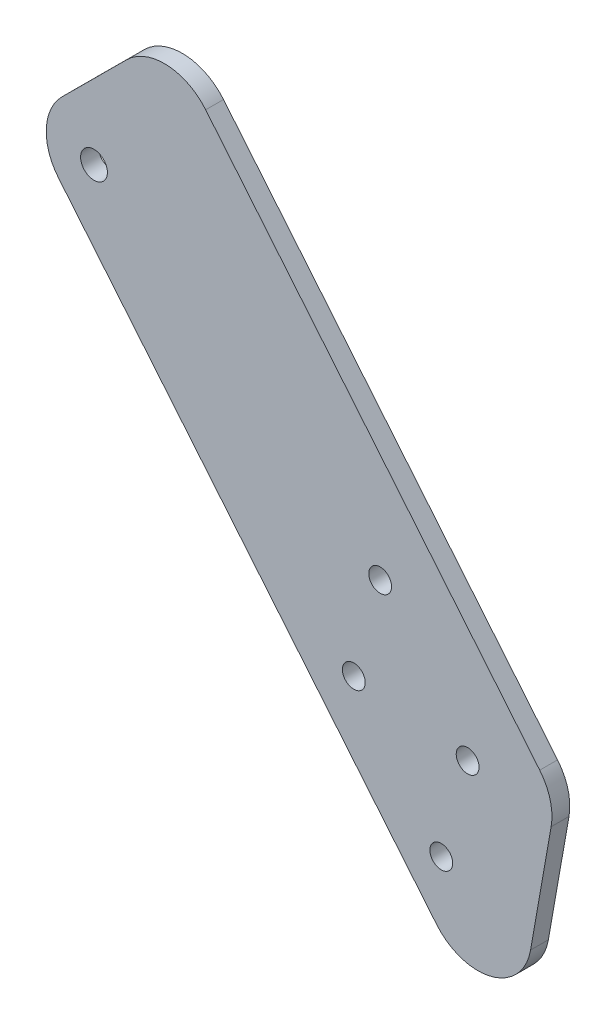
ISO-10303-21;
HEADER;
FILE_DESCRIPTION(('STEP AP214'),'2;1');
FILE_NAME('part.step','',(''),(''),'','','');
FILE_SCHEMA(('AUTOMOTIVE_DESIGN { 1 0 10303 214 1 1 1 1 }'));
ENDSEC;
DATA;
#1=APPLICATION_CONTEXT('core data for automotive mechanical design processes');
#2=APPLICATION_PROTOCOL_DEFINITION('international standard','automotive_design',2000,#1);
#3=PRODUCT_CONTEXT('',#1,'mechanical');
#4=PRODUCT('Part','Part','',(#3));
#5=PRODUCT_RELATED_PRODUCT_CATEGORY('part','',(#4));
#6=PRODUCT_DEFINITION_FORMATION('','',#4);
#7=PRODUCT_DEFINITION_CONTEXT('part definition',#1,'design');
#8=PRODUCT_DEFINITION('design','',#6,#7);
#9=PRODUCT_DEFINITION_SHAPE('','',#8);
#10=(LENGTH_UNIT() NAMED_UNIT(*) SI_UNIT(.MILLI.,.METRE.));
#11=(NAMED_UNIT(*) PLANE_ANGLE_UNIT() SI_UNIT($,.RADIAN.));
#12=(NAMED_UNIT(*) SI_UNIT($,.STERADIAN.) SOLID_ANGLE_UNIT());
#13=UNCERTAINTY_MEASURE_WITH_UNIT(LENGTH_MEASURE(1.E-05),#10,'distance_accuracy_value','');
#14=(GEOMETRIC_REPRESENTATION_CONTEXT(3) GLOBAL_UNCERTAINTY_ASSIGNED_CONTEXT((#13)) GLOBAL_UNIT_ASSIGNED_CONTEXT((#10,
#11,#12)) REPRESENTATION_CONTEXT('',''));
#15=CARTESIAN_POINT('',(0.,0.,0.));
#16=DIRECTION('',(0.,0.,1.));
#17=DIRECTION('',(1.,0.,0.));
#18=AXIS2_PLACEMENT_3D('',#15,#16,#17);
#19=CARTESIAN_POINT('',(0.,0.,3.175));
#20=DIRECTION('',(0.,0.,1.));
#21=DIRECTION('',(1.,0.,0.));
#22=AXIS2_PLACEMENT_3D('',#19,#20,#21);
#23=PLANE('',#22);
#24=CARTESIAN_POINT('',(39.7630839702651,-33.9317121800044,3.175));
#25=DIRECTION('',(0.,0.,1.));
#26=DIRECTION('',(1.,0.,0.));
#27=AXIS2_PLACEMENT_3D('',#24,#25,#26);
#28=CIRCLE('',#27,2.03199999999995);
#29=CARTESIAN_POINT('',(41.7950839702651,-33.9317121800044,3.175));
#30=VERTEX_POINT('',#29);
#31=EDGE_CURVE('E200',#30,#30,#28,.T.);
#32=ORIENTED_EDGE('',*,*,#31,.F.);
#33=EDGE_LOOP('',(#32));
#34=FACE_BOUND('',#33,.T.);
#35=CARTESIAN_POINT('',(24.1866608878981,-13.8684361773397,3.175));
#36=DIRECTION('',(0.,0.,1.));
#37=DIRECTION('',(1.,0.,0.));
#38=AXIS2_PLACEMENT_3D('',#35,#36,#37);
#39=CIRCLE('',#38,2.03199999999995);
#40=CARTESIAN_POINT('',(26.2186608878981,-13.8684361773397,3.175));
#41=VERTEX_POINT('',#40);
#42=EDGE_CURVE('E186',#41,#41,#39,.T.);
#43=ORIENTED_EDGE('',*,*,#42,.F.);
#44=EDGE_LOOP('',(#43));
#45=FACE_BOUND('',#44,.T.);
#46=DIRECTION('',(0.637148115093732,-0.770741382976485,0.));
#47=VECTOR('',#46,1.);
#48=CARTESIAN_POINT('',(-38.6358359034956,26.2089915274128,3.175));
#49=LINE('',#48,#47);
#50=CARTESIAN_POINT('',(-33.1051855118644,19.5187086392995,3.175));
#51=VERTEX_POINT('',#50);
#52=CARTESIAN_POINT('',(34.2490651466294,-61.9579638518925,3.175));
#53=VERTEX_POINT('',#52);
#54=EDGE_CURVE('E172',#51,#53,#49,.T.);
#55=ORIENTED_EDGE('',*,*,#54,.T.);
#56=CARTESIAN_POINT('',(41.5903768194804,-55.8891280556247,3.175));
#57=DIRECTION('',(0.,0.,1.));
#58=DIRECTION('',(1.,0.,0.));
#59=AXIS2_PLACEMENT_3D('',#56,#57,#58);
#60=CIRCLE('',#59,9.525);
#61=CARTESIAN_POINT('',(50.9716482494746,-57.5375731887043,3.175));
#62=VERTEX_POINT('',#61);
#63=EDGE_CURVE('E154',#53,#62,#60,.T.);
#64=ORIENTED_EDGE('',*,*,#63,.T.);
#65=DIRECTION('',(0.173065105835129,0.984910386351101,0.));
#66=VECTOR('',#65,1.);
#67=CARTESIAN_POINT('',(55.395997605468,-32.3586810455652,3.175));
#68=LINE('',#67,#66);
#69=CARTESIAN_POINT('',(54.6361895228833,-36.6827350977094,3.175));
#70=VERTEX_POINT('',#69);
#71=EDGE_CURVE('E124',#62,#70,#68,.T.);
#72=ORIENTED_EDGE('',*,*,#71,.T.);
#73=CARTESIAN_POINT('',(45.2549180928891,-35.0342899646298,3.175));
#74=DIRECTION('',(0.,0.,1.));
#75=DIRECTION('',(1.,0.,0.));
#76=AXIS2_PLACEMENT_3D('',#73,#74,#75);
#77=CIRCLE('',#76,9.525);
#78=CARTESIAN_POINT('',(52.6018762196354,-28.9722910134722,3.175));
#79=VERTEX_POINT('',#78);
#80=EDGE_CURVE('E63',#70,#79,#77,.T.);
#81=ORIENTED_EDGE('',*,*,#80,.T.);
#82=DIRECTION('',(-0.636430336079536,0.77133418653505,0.));
#83=VECTOR('',#82,1.);
#84=CARTESIAN_POINT('',(-13.5495627824215,51.2012385908707,3.175));
#85=LINE('',#84,#83);
#86=CARTESIAN_POINT('',(-6.89145079548248,43.1318096177944,3.175));
#87=VERTEX_POINT('',#86);
#88=EDGE_CURVE('E143',#79,#87,#85,.T.);
#89=ORIENTED_EDGE('',*,*,#88,.T.);
#90=CARTESIAN_POINT('',(-14.2384089222288,37.0698106666368,3.175));
#91=DIRECTION('',(0.,0.,1.));
#92=DIRECTION('',(1.,0.,0.));
#93=AXIS2_PLACEMENT_3D('',#90,#91,#92);
#94=CIRCLE('',#93,9.525);
#95=CARTESIAN_POINT('',(-20.9609433514752,43.8176366756265,3.175));
#96=VERTEX_POINT('',#95);
#97=EDGE_CURVE('E155',#87,#96,#94,.T.);
#98=ORIENTED_EDGE('',*,*,#97,.T.);
#99=DIRECTION('',(-0.708433176796818,-0.705777892834261,0.));
#100=VECTOR('',#99,1.);
#101=CARTESIAN_POINT('',(-13.5495627824215,51.2012385908707,3.175));
#102=LINE('',#101,#100);
#103=CARTESIAN_POINT('',(-32.4864082682597,32.335370444557,3.175));
#104=VERTEX_POINT('',#103);
#105=EDGE_CURVE('E134',#96,#104,#102,.T.);
#106=ORIENTED_EDGE('',*,*,#105,.T.);
#107=CARTESIAN_POINT('',(-25.7638738390134,25.5875444355673,3.175));
#108=DIRECTION('',(0.,0.,1.));
#109=DIRECTION('',(1.,0.,0.));
#110=AXIS2_PLACEMENT_3D('',#107,#108,#109);
#111=CIRCLE('',#110,9.525);
#112=EDGE_CURVE('E147',#104,#51,#111,.T.);
#113=ORIENTED_EDGE('',*,*,#112,.T.);
#114=EDGE_LOOP('',(#55,#64,#72,#81,#89,#98,#106,#113));
#115=FACE_BOUND('',#114,.T.);
#116=CARTESIAN_POINT('',(-26.780789005773,24.7075450212325,3.175));
#117=DIRECTION('',(0.,0.,1.));
#118=DIRECTION('',(1.,0.,0.));
#119=AXIS2_PLACEMENT_3D('',#116,#117,#118);
#120=CIRCLE('',#119,2.39000000000004);
#121=CARTESIAN_POINT('',(-24.3907890057729,24.7075450212325,3.175));
#122=VERTEX_POINT('',#121);
#123=EDGE_CURVE('E177',#122,#122,#120,.T.);
#124=ORIENTED_EDGE('',*,*,#123,.F.);
#125=EDGE_LOOP('',(#124));
#126=FACE_BOUND('',#125,.T.);
#127=CARTESIAN_POINT('',(19.493324021,-31.0178090245844,3.175));
#128=DIRECTION('',(0.,0.,1.));
#129=DIRECTION('',(1.,0.,0.));
#130=AXIS2_PLACEMENT_3D('',#127,#128,#129);
#131=CIRCLE('',#130,2.03199999999995);
#132=CARTESIAN_POINT('',(21.5253240209999,-31.0178090245844,3.175));
#133=VERTEX_POINT('',#132);
#134=EDGE_CURVE('E191',#133,#133,#131,.T.);
#135=ORIENTED_EDGE('',*,*,#134,.F.);
#136=EDGE_LOOP('',(#135));
#137=FACE_BOUND('',#136,.T.);
#138=CARTESIAN_POINT('',(35.0697471033671,-51.0810850272492,3.175));
#139=DIRECTION('',(0.,0.,1.));
#140=DIRECTION('',(1.,0.,0.));
#141=AXIS2_PLACEMENT_3D('',#138,#139,#140);
#142=CIRCLE('',#141,2.03199999999995);
#143=CARTESIAN_POINT('',(37.1017471033671,-51.0810850272492,3.175));
#144=VERTEX_POINT('',#143);
#145=EDGE_CURVE('E202',#144,#144,#142,.T.);
#146=ORIENTED_EDGE('',*,*,#145,.F.);
#147=EDGE_LOOP('',(#146));
#148=FACE_BOUND('',#147,.T.);
#149=ADVANCED_FACE('F39',(#34,#45,#115,#126,#137,#148),#23,.T.);
#150=CARTESIAN_POINT('',(0.,0.,0.));
#151=DIRECTION('',(0.,0.,1.));
#152=DIRECTION('',(1.,0.,0.));
#153=AXIS2_PLACEMENT_3D('',#150,#151,#152);
#154=PLANE('',#153);
#155=DIRECTION('',(0.173065105835129,0.984910386351101,0.));
#156=VECTOR('',#155,1.);
#157=CARTESIAN_POINT('',(55.395997605468,-32.3586810455652,0.));
#158=LINE('',#157,#156);
#159=CARTESIAN_POINT('',(50.9716482494746,-57.5375731887043,0.));
#160=VERTEX_POINT('',#159);
#161=CARTESIAN_POINT('',(54.6361895228833,-36.6827350977094,0.));
#162=VERTEX_POINT('',#161);
#163=EDGE_CURVE('E121',#160,#162,#158,.T.);
#164=ORIENTED_EDGE('',*,*,#163,.F.);
#165=CARTESIAN_POINT('',(41.5903768194804,-55.8891280556247,0.));
#166=DIRECTION('',(0.,0.,1.));
#167=DIRECTION('',(1.,0.,0.));
#168=AXIS2_PLACEMENT_3D('',#165,#166,#167);
#169=CIRCLE('',#168,9.525);
#170=CARTESIAN_POINT('',(34.2490651466294,-61.9579638518925,0.));
#171=VERTEX_POINT('',#170);
#172=EDGE_CURVE('E106',#160,#171,#169,.F.);
#173=ORIENTED_EDGE('',*,*,#172,.T.);
#174=DIRECTION('',(0.637148115093732,-0.770741382976485,0.));
#175=VECTOR('',#174,1.);
#176=CARTESIAN_POINT('',(-38.6358359034956,26.2089915274128,0.));
#177=LINE('',#176,#175);
#178=CARTESIAN_POINT('',(-33.1051855118644,19.5187086392995,0.));
#179=VERTEX_POINT('',#178);
#180=EDGE_CURVE('E131',#179,#171,#177,.T.);
#181=ORIENTED_EDGE('',*,*,#180,.F.);
#182=CARTESIAN_POINT('',(-25.7638738390134,25.5875444355673,0.));
#183=DIRECTION('',(0.,0.,1.));
#184=DIRECTION('',(1.,0.,0.));
#185=AXIS2_PLACEMENT_3D('',#182,#183,#184);
#186=CIRCLE('',#185,9.525);
#187=CARTESIAN_POINT('',(-32.4864082682597,32.335370444557,0.));
#188=VERTEX_POINT('',#187);
#189=EDGE_CURVE('E127',#179,#188,#186,.F.);
#190=ORIENTED_EDGE('',*,*,#189,.T.);
#191=DIRECTION('',(-0.708433176796818,-0.705777892834261,0.));
#192=VECTOR('',#191,1.);
#193=CARTESIAN_POINT('',(-13.5495627824215,51.2012385908707,0.));
#194=LINE('',#193,#192);
#195=CARTESIAN_POINT('',(-20.9609433514752,43.8176366756265,0.));
#196=VERTEX_POINT('',#195);
#197=EDGE_CURVE('E140',#196,#188,#194,.T.);
#198=ORIENTED_EDGE('',*,*,#197,.F.);
#199=CARTESIAN_POINT('',(-14.2384089222288,37.0698106666368,0.));
#200=DIRECTION('',(0.,0.,1.));
#201=DIRECTION('',(1.,0.,0.));
#202=AXIS2_PLACEMENT_3D('',#199,#200,#201);
#203=CIRCLE('',#202,9.525);
#204=CARTESIAN_POINT('',(-6.89145079548248,43.1318096177944,0.));
#205=VERTEX_POINT('',#204);
#206=EDGE_CURVE('E145',#196,#205,#203,.F.);
#207=ORIENTED_EDGE('',*,*,#206,.T.);
#208=DIRECTION('',(-0.636430336079536,0.77133418653505,0.));
#209=VECTOR('',#208,1.);
#210=CARTESIAN_POINT('',(-13.5495627824215,51.2012385908707,0.));
#211=LINE('',#210,#209);
#212=CARTESIAN_POINT('',(52.6018762196354,-28.9722910134722,0.));
#213=VERTEX_POINT('',#212);
#214=EDGE_CURVE('E135',#213,#205,#211,.T.);
#215=ORIENTED_EDGE('',*,*,#214,.F.);
#216=CARTESIAN_POINT('',(45.2549180928891,-35.0342899646298,0.));
#217=DIRECTION('',(0.,0.,1.));
#218=DIRECTION('',(1.,0.,0.));
#219=AXIS2_PLACEMENT_3D('',#216,#217,#218);
#220=CIRCLE('',#219,9.525);
#221=EDGE_CURVE('E120',#213,#162,#220,.F.);
#222=ORIENTED_EDGE('',*,*,#221,.T.);
#223=EDGE_LOOP('',(#164,#173,#181,#190,#198,#207,#215,#222));
#224=FACE_BOUND('',#223,.T.);
#225=CARTESIAN_POINT('',(-26.780789005773,24.7075450212325,0.));
#226=DIRECTION('',(0.,0.,1.));
#227=DIRECTION('',(1.,0.,0.));
#228=AXIS2_PLACEMENT_3D('',#225,#226,#227);
#229=CIRCLE('',#228,2.39000000000004);
#230=CARTESIAN_POINT('',(-24.3907890057729,24.7075450212325,0.));
#231=VERTEX_POINT('',#230);
#232=EDGE_CURVE('E182',#231,#231,#229,.T.);
#233=ORIENTED_EDGE('',*,*,#232,.T.);
#234=EDGE_LOOP('',(#233));
#235=FACE_BOUND('',#234,.T.);
#236=CARTESIAN_POINT('',(24.1866608878981,-13.8684361773397,0.));
#237=DIRECTION('',(0.,0.,1.));
#238=DIRECTION('',(1.,0.,0.));
#239=AXIS2_PLACEMENT_3D('',#236,#237,#238);
#240=CIRCLE('',#239,2.03199999999995);
#241=CARTESIAN_POINT('',(26.2186608878981,-13.8684361773397,0.));
#242=VERTEX_POINT('',#241);
#243=EDGE_CURVE('E189',#242,#242,#240,.T.);
#244=ORIENTED_EDGE('',*,*,#243,.T.);
#245=EDGE_LOOP('',(#244));
#246=FACE_BOUND('',#245,.T.);
#247=CARTESIAN_POINT('',(19.493324021,-31.0178090245844,0.));
#248=DIRECTION('',(0.,0.,1.));
#249=DIRECTION('',(1.,0.,0.));
#250=AXIS2_PLACEMENT_3D('',#247,#248,#249);
#251=CIRCLE('',#250,2.03199999999995);
#252=CARTESIAN_POINT('',(21.5253240209999,-31.0178090245844,0.));
#253=VERTEX_POINT('',#252);
#254=EDGE_CURVE('E198',#253,#253,#251,.T.);
#255=ORIENTED_EDGE('',*,*,#254,.T.);
#256=EDGE_LOOP('',(#255));
#257=FACE_BOUND('',#256,.T.);
#258=CARTESIAN_POINT('',(39.7630839702651,-33.9317121800044,0.));
#259=DIRECTION('',(0.,0.,1.));
#260=DIRECTION('',(1.,0.,0.));
#261=AXIS2_PLACEMENT_3D('',#258,#259,#260);
#262=CIRCLE('',#261,2.03199999999995);
#263=CARTESIAN_POINT('',(41.7950839702651,-33.9317121800044,0.));
#264=VERTEX_POINT('',#263);
#265=EDGE_CURVE('E205',#264,#264,#262,.T.);
#266=ORIENTED_EDGE('',*,*,#265,.T.);
#267=EDGE_LOOP('',(#266));
#268=FACE_BOUND('',#267,.T.);
#269=CARTESIAN_POINT('',(35.0697471033671,-51.0810850272492,0.));
#270=DIRECTION('',(0.,0.,1.));
#271=DIRECTION('',(1.,0.,0.));
#272=AXIS2_PLACEMENT_3D('',#269,#270,#271);
#273=CIRCLE('',#272,2.03199999999995);
#274=CARTESIAN_POINT('',(37.1017471033671,-51.0810850272492,0.));
#275=VERTEX_POINT('',#274);
#276=EDGE_CURVE('E208',#275,#275,#273,.T.);
#277=ORIENTED_EDGE('',*,*,#276,.T.);
#278=EDGE_LOOP('',(#277));
#279=FACE_BOUND('',#278,.T.);
#280=ADVANCED_FACE('F129',(#224,#235,#246,#257,#268,#279),#154,.F.);
#281=CARTESIAN_POINT('',(-13.5495627824215,51.2012385908707,3.175));
#282=DIRECTION('',(0.705777892834261,-0.708433176796817,0.));
#283=DIRECTION('',(0.708433176796817,0.705777892834261,0.));
#284=AXIS2_PLACEMENT_3D('',#281,#282,#283);
#285=PLANE('',#284);
#286=ORIENTED_EDGE('',*,*,#105,.F.);
#287=DIRECTION('',(0.,0.,-1.));
#288=VECTOR('',#287,1.);
#289=CARTESIAN_POINT('',(-20.9609433514752,43.8176366756265,3.175));
#290=LINE('',#289,#288);
#291=EDGE_CURVE('E11',#96,#196,#290,.T.);
#292=ORIENTED_EDGE('',*,*,#291,.T.);
#293=ORIENTED_EDGE('',*,*,#197,.T.);
#294=DIRECTION('',(0.,0.,-1.));
#295=VECTOR('',#294,1.);
#296=CARTESIAN_POINT('',(-32.4864082682597,32.335370444557,3.175));
#297=LINE('',#296,#295);
#298=EDGE_CURVE('E50',#188,#104,#297,.F.);
#299=ORIENTED_EDGE('',*,*,#298,.T.);
#300=EDGE_LOOP('',(#286,#292,#293,#299));
#301=FACE_BOUND('',#300,.T.);
#302=ADVANCED_FACE('F164',(#301),#285,.F.);
#303=CARTESIAN_POINT('',(-38.6358359034956,26.2089915274128,3.175));
#304=DIRECTION('',(0.770741382976485,0.637148115093732,0.));
#305=DIRECTION('',(-0.637148115093732,0.770741382976485,0.));
#306=AXIS2_PLACEMENT_3D('',#303,#304,#305);
#307=PLANE('',#306);
#308=ORIENTED_EDGE('',*,*,#180,.T.);
#309=DIRECTION('',(0.,0.,-1.));
#310=VECTOR('',#309,1.);
#311=CARTESIAN_POINT('',(34.2490651466294,-61.9579638518925,3.175));
#312=LINE('',#311,#310);
#313=EDGE_CURVE('E112',#171,#53,#312,.F.);
#314=ORIENTED_EDGE('',*,*,#313,.T.);
#315=ORIENTED_EDGE('',*,*,#54,.F.);
#316=DIRECTION('',(0.,0.,-1.));
#317=VECTOR('',#316,1.);
#318=CARTESIAN_POINT('',(-33.1051855118644,19.5187086392995,3.175));
#319=LINE('',#318,#317);
#320=EDGE_CURVE('E118',#51,#179,#319,.T.);
#321=ORIENTED_EDGE('',*,*,#320,.T.);
#322=EDGE_LOOP('',(#308,#314,#315,#321));
#323=FACE_BOUND('',#322,.T.);
#324=ADVANCED_FACE('F176',(#323),#307,.F.);
#325=CARTESIAN_POINT('',(55.395997605468,-32.3586810455652,3.175));
#326=DIRECTION('',(-0.984910386351101,0.173065105835129,0.));
#327=DIRECTION('',(-0.173065105835129,-0.984910386351101,0.));
#328=AXIS2_PLACEMENT_3D('',#325,#326,#327);
#329=PLANE('',#328);
#330=ORIENTED_EDGE('',*,*,#71,.F.);
#331=DIRECTION('',(0.,0.,-1.));
#332=VECTOR('',#331,1.);
#333=CARTESIAN_POINT('',(50.9716482494746,-57.5375731887043,3.175));
#334=LINE('',#333,#332);
#335=EDGE_CURVE('E109',#62,#160,#334,.T.);
#336=ORIENTED_EDGE('',*,*,#335,.T.);
#337=ORIENTED_EDGE('',*,*,#163,.T.);
#338=DIRECTION('',(0.,0.,-1.));
#339=VECTOR('',#338,1.);
#340=CARTESIAN_POINT('',(54.6361895228833,-36.6827350977094,3.175));
#341=LINE('',#340,#339);
#342=EDGE_CURVE('E130',#162,#70,#341,.F.);
#343=ORIENTED_EDGE('',*,*,#342,.T.);
#344=EDGE_LOOP('',(#330,#336,#337,#343));
#345=FACE_BOUND('',#344,.T.);
#346=ADVANCED_FACE('F125',(#345),#329,.F.);
#347=CARTESIAN_POINT('',(-13.5495627824215,51.2012385908707,3.175));
#348=DIRECTION('',(-0.771334186535051,-0.636430336079537,0.));
#349=DIRECTION('',(0.636430336079537,-0.771334186535051,0.));
#350=AXIS2_PLACEMENT_3D('',#347,#348,#349);
#351=PLANE('',#350);
#352=ORIENTED_EDGE('',*,*,#88,.F.);
#353=DIRECTION('',(0.,0.,-1.));
#354=VECTOR('',#353,1.);
#355=CARTESIAN_POINT('',(52.6018762196354,-28.9722910134722,3.175));
#356=LINE('',#355,#354);
#357=EDGE_CURVE('E158',#79,#213,#356,.T.);
#358=ORIENTED_EDGE('',*,*,#357,.T.);
#359=ORIENTED_EDGE('',*,*,#214,.T.);
#360=DIRECTION('',(0.,0.,-1.));
#361=VECTOR('',#360,1.);
#362=CARTESIAN_POINT('',(-6.89145079548247,43.1318096177944,3.175));
#363=LINE('',#362,#361);
#364=EDGE_CURVE('E53',#205,#87,#363,.F.);
#365=ORIENTED_EDGE('',*,*,#364,.T.);
#366=EDGE_LOOP('',(#352,#358,#359,#365));
#367=FACE_BOUND('',#366,.T.);
#368=ADVANCED_FACE('F233',(#367),#351,.F.);
#369=CARTESIAN_POINT('',(-26.780789005773,24.7075450212325,3.175));
#370=DIRECTION('',(0.,0.,-1.));
#371=DIRECTION('',(-1.,0.,0.));
#372=AXIS2_PLACEMENT_3D('',#369,#370,#371);
#373=CYLINDRICAL_SURFACE('',#372,2.39000000000004);
#374=ORIENTED_EDGE('',*,*,#123,.T.);
#375=EDGE_LOOP('',(#374));
#376=FACE_BOUND('',#375,.T.);
#377=ORIENTED_EDGE('',*,*,#232,.F.);
#378=EDGE_LOOP('',(#377));
#379=FACE_BOUND('',#378,.T.);
#380=ADVANCED_FACE('F226',(#376,#379),#373,.F.);
#381=CARTESIAN_POINT('',(24.1866608878981,-13.8684361773397,3.175));
#382=DIRECTION('',(0.,0.,-1.));
#383=DIRECTION('',(-1.,0.,0.));
#384=AXIS2_PLACEMENT_3D('',#381,#382,#383);
#385=CYLINDRICAL_SURFACE('',#384,2.03199999999995);
#386=ORIENTED_EDGE('',*,*,#42,.T.);
#387=EDGE_LOOP('',(#386));
#388=FACE_BOUND('',#387,.T.);
#389=ORIENTED_EDGE('',*,*,#243,.F.);
#390=EDGE_LOOP('',(#389));
#391=FACE_BOUND('',#390,.T.);
#392=ADVANCED_FACE('F300',(#388,#391),#385,.F.);
#393=CARTESIAN_POINT('',(19.493324021,-31.0178090245844,3.175));
#394=DIRECTION('',(0.,0.,-1.));
#395=DIRECTION('',(-1.,0.,0.));
#396=AXIS2_PLACEMENT_3D('',#393,#394,#395);
#397=CYLINDRICAL_SURFACE('',#396,2.03199999999995);
#398=ORIENTED_EDGE('',*,*,#134,.T.);
#399=EDGE_LOOP('',(#398));
#400=FACE_BOUND('',#399,.T.);
#401=ORIENTED_EDGE('',*,*,#254,.F.);
#402=EDGE_LOOP('',(#401));
#403=FACE_BOUND('',#402,.T.);
#404=ADVANCED_FACE('F290',(#400,#403),#397,.F.);
#405=CARTESIAN_POINT('',(39.7630839702651,-33.9317121800044,3.175));
#406=DIRECTION('',(0.,0.,-1.));
#407=DIRECTION('',(-1.,0.,0.));
#408=AXIS2_PLACEMENT_3D('',#405,#406,#407);
#409=CYLINDRICAL_SURFACE('',#408,2.03199999999995);
#410=ORIENTED_EDGE('',*,*,#31,.T.);
#411=EDGE_LOOP('',(#410));
#412=FACE_BOUND('',#411,.T.);
#413=ORIENTED_EDGE('',*,*,#265,.F.);
#414=EDGE_LOOP('',(#413));
#415=FACE_BOUND('',#414,.T.);
#416=ADVANCED_FACE('F279',(#412,#415),#409,.F.);
#417=CARTESIAN_POINT('',(35.0697471033671,-51.0810850272492,3.175));
#418=DIRECTION('',(0.,0.,-1.));
#419=DIRECTION('',(-1.,0.,0.));
#420=AXIS2_PLACEMENT_3D('',#417,#418,#419);
#421=CYLINDRICAL_SURFACE('',#420,2.03199999999995);
#422=ORIENTED_EDGE('',*,*,#145,.T.);
#423=EDGE_LOOP('',(#422));
#424=FACE_BOUND('',#423,.T.);
#425=ORIENTED_EDGE('',*,*,#276,.F.);
#426=EDGE_LOOP('',(#425));
#427=FACE_BOUND('',#426,.T.);
#428=ADVANCED_FACE('F212',(#424,#427),#421,.F.);
#429=CARTESIAN_POINT('',(41.5903768194804,-55.8891280556247,3.175));
#430=DIRECTION('',(0.,0.,-1.));
#431=DIRECTION('',(-1.,0.,0.));
#432=AXIS2_PLACEMENT_3D('',#429,#430,#431);
#433=CYLINDRICAL_SURFACE('',#432,9.525);
#434=ORIENTED_EDGE('',*,*,#63,.F.);
#435=ORIENTED_EDGE('',*,*,#313,.F.);
#436=ORIENTED_EDGE('',*,*,#172,.F.);
#437=ORIENTED_EDGE('',*,*,#335,.F.);
#438=EDGE_LOOP('',(#434,#435,#436,#437));
#439=FACE_BOUND('',#438,.T.);
#440=ADVANCED_FACE('F108',(#439),#433,.T.);
#441=CARTESIAN_POINT('',(45.2549180928891,-35.0342899646298,3.175));
#442=DIRECTION('',(0.,0.,-1.));
#443=DIRECTION('',(-1.,0.,0.));
#444=AXIS2_PLACEMENT_3D('',#441,#442,#443);
#445=CYLINDRICAL_SURFACE('',#444,9.525);
#446=ORIENTED_EDGE('',*,*,#80,.F.);
#447=ORIENTED_EDGE('',*,*,#342,.F.);
#448=ORIENTED_EDGE('',*,*,#221,.F.);
#449=ORIENTED_EDGE('',*,*,#357,.F.);
#450=EDGE_LOOP('',(#446,#447,#448,#449));
#451=FACE_BOUND('',#450,.T.);
#452=ADVANCED_FACE('F245',(#451),#445,.T.);
#453=CARTESIAN_POINT('',(-14.2384089222288,37.0698106666368,3.175));
#454=DIRECTION('',(0.,0.,-1.));
#455=DIRECTION('',(-1.,0.,0.));
#456=AXIS2_PLACEMENT_3D('',#453,#454,#455);
#457=CYLINDRICAL_SURFACE('',#456,9.525);
#458=ORIENTED_EDGE('',*,*,#97,.F.);
#459=ORIENTED_EDGE('',*,*,#364,.F.);
#460=ORIENTED_EDGE('',*,*,#206,.F.);
#461=ORIENTED_EDGE('',*,*,#291,.F.);
#462=EDGE_LOOP('',(#458,#459,#460,#461));
#463=FACE_BOUND('',#462,.T.);
#464=ADVANCED_FACE('F242',(#463),#457,.T.);
#465=CARTESIAN_POINT('',(-25.7638738390134,25.5875444355673,3.175));
#466=DIRECTION('',(0.,0.,-1.));
#467=DIRECTION('',(-1.,0.,0.));
#468=AXIS2_PLACEMENT_3D('',#465,#466,#467);
#469=CYLINDRICAL_SURFACE('',#468,9.525);
#470=ORIENTED_EDGE('',*,*,#112,.F.);
#471=ORIENTED_EDGE('',*,*,#298,.F.);
#472=ORIENTED_EDGE('',*,*,#189,.F.);
#473=ORIENTED_EDGE('',*,*,#320,.F.);
#474=EDGE_LOOP('',(#470,#471,#472,#473));
#475=FACE_BOUND('',#474,.T.);
#476=ADVANCED_FACE('F41',(#475),#469,.T.);
#477=CLOSED_SHELL('',(#149,#280,#302,#324,#346,#368,#380,#392,#404,#416,#428,#440,#452,#464,#476));
#478=MANIFOLD_SOLID_BREP('B2',#477);
#479=ADVANCED_BREP_SHAPE_REPRESENTATION('',(#18,#478),#14);
#480=SHAPE_DEFINITION_REPRESENTATION(#9,#479);
ENDSEC;
END-ISO-10303-21;
